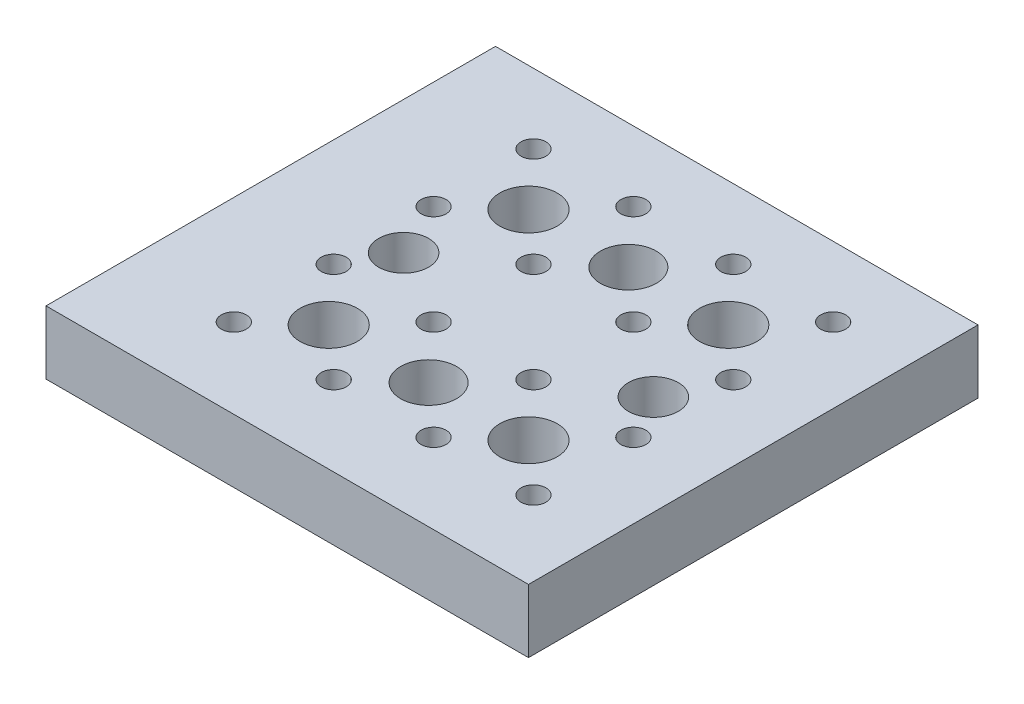
ISO-10303-21;
HEADER;
FILE_DESCRIPTION(('STEP AP214'),'2;1');
FILE_NAME('part.step','',(''),(''),'','','');
FILE_SCHEMA(('AUTOMOTIVE_DESIGN { 1 0 10303 214 1 1 1 1 }'));
ENDSEC;
DATA;
#1=APPLICATION_CONTEXT('core data for automotive mechanical design processes');
#2=APPLICATION_PROTOCOL_DEFINITION('international standard','automotive_design',2000,#1);
#3=PRODUCT_CONTEXT('',#1,'mechanical');
#4=PRODUCT('Part','Part','',(#3));
#5=PRODUCT_RELATED_PRODUCT_CATEGORY('part','',(#4));
#6=PRODUCT_DEFINITION_FORMATION('','',#4);
#7=PRODUCT_DEFINITION_CONTEXT('part definition',#1,'design');
#8=PRODUCT_DEFINITION('design','',#6,#7);
#9=PRODUCT_DEFINITION_SHAPE('','',#8);
#10=(LENGTH_UNIT() NAMED_UNIT(*) SI_UNIT(.MILLI.,.METRE.));
#11=(NAMED_UNIT(*) PLANE_ANGLE_UNIT() SI_UNIT($,.RADIAN.));
#12=(NAMED_UNIT(*) SI_UNIT($,.STERADIAN.) SOLID_ANGLE_UNIT());
#13=UNCERTAINTY_MEASURE_WITH_UNIT(LENGTH_MEASURE(1.E-05),#10,'distance_accuracy_value','');
#14=(GEOMETRIC_REPRESENTATION_CONTEXT(3) GLOBAL_UNCERTAINTY_ASSIGNED_CONTEXT((#13)) GLOBAL_UNIT_ASSIGNED_CONTEXT((#10,
#11,#12)) REPRESENTATION_CONTEXT('',''));
#15=CARTESIAN_POINT('',(0.,0.,0.));
#16=DIRECTION('',(0.,0.,1.));
#17=DIRECTION('',(1.,0.,0.));
#18=AXIS2_PLACEMENT_3D('',#15,#16,#17);
#19=CARTESIAN_POINT('',(0.,6.35,0.));
#20=DIRECTION('',(0.,1.,0.));
#21=DIRECTION('',(0.,0.,1.));
#22=AXIS2_PLACEMENT_3D('',#19,#20,#21);
#23=PLANE('',#22);
#24=CARTESIAN_POINT('',(38.3,6.35,22.5));
#25=DIRECTION('',(0.,1.,0.));
#26=DIRECTION('',(0.,0.,1.));
#27=AXIS2_PLACEMENT_3D('',#24,#25,#26);
#28=CIRCLE('',#27,2.49999999999999);
#29=CARTESIAN_POINT('',(38.3,6.35,25.));
#30=VERTEX_POINT('',#29);
#31=EDGE_CURVE('E306',#30,#30,#28,.T.);
#32=ORIENTED_EDGE('',*,*,#31,.F.);
#33=EDGE_LOOP('',(#32));
#34=FACE_BOUND('',#33,.T.);
#35=CARTESIAN_POINT('',(25.8,6.35,12.5));
#36=DIRECTION('',(0.,1.,0.));
#37=DIRECTION('',(0.,0.,1.));
#38=AXIS2_PLACEMENT_3D('',#35,#36,#37);
#39=CIRCLE('',#38,2.8);
#40=CARTESIAN_POINT('',(25.8,6.35,15.3));
#41=VERTEX_POINT('',#40);
#42=EDGE_CURVE('E290',#41,#41,#39,.T.);
#43=ORIENTED_EDGE('',*,*,#42,.F.);
#44=EDGE_LOOP('',(#43));
#45=FACE_BOUND('',#44,.T.);
#46=CARTESIAN_POINT('',(10.8000000000002,6.35,27.));
#47=DIRECTION('',(0.,1.,0.));
#48=DIRECTION('',(0.,0.,1.));
#49=AXIS2_PLACEMENT_3D('',#46,#47,#48);
#50=CIRCLE('',#49,1.25);
#51=CARTESIAN_POINT('',(10.8000000000002,6.35,28.25));
#52=VERTEX_POINT('',#51);
#53=EDGE_CURVE('E274',#52,#52,#50,.T.);
#54=ORIENTED_EDGE('',*,*,#53,.F.);
#55=EDGE_LOOP('',(#54));
#56=FACE_BOUND('',#55,.T.);
#57=CARTESIAN_POINT('',(40.8000000000003,6.35,37.));
#58=DIRECTION('',(0.,1.,0.));
#59=DIRECTION('',(0.,0.,1.));
#60=AXIS2_PLACEMENT_3D('',#57,#58,#59);
#61=CIRCLE('',#60,1.25);
#62=CARTESIAN_POINT('',(40.8000000000003,6.35,38.25));
#63=VERTEX_POINT('',#62);
#64=EDGE_CURVE('E258',#63,#63,#61,.T.);
#65=ORIENTED_EDGE('',*,*,#64,.F.);
#66=EDGE_LOOP('',(#65));
#67=FACE_BOUND('',#66,.T.);
#68=CARTESIAN_POINT('',(20.8000000000003,6.35,37.));
#69=DIRECTION('',(0.,1.,0.));
#70=DIRECTION('',(0.,0.,1.));
#71=AXIS2_PLACEMENT_3D('',#68,#69,#70);
#72=CIRCLE('',#71,1.25);
#73=CARTESIAN_POINT('',(20.8000000000003,6.35,38.25));
#74=VERTEX_POINT('',#73);
#75=EDGE_CURVE('E242',#74,#74,#72,.T.);
#76=ORIENTED_EDGE('',*,*,#75,.F.);
#77=EDGE_LOOP('',(#76));
#78=FACE_BOUND('',#77,.T.);
#79=CARTESIAN_POINT('',(30.8000000000002,6.35,27.));
#80=DIRECTION('',(0.,1.,0.));
#81=DIRECTION('',(0.,0.,1.));
#82=AXIS2_PLACEMENT_3D('',#79,#80,#81);
#83=CIRCLE('',#82,1.25);
#84=CARTESIAN_POINT('',(30.8000000000002,6.35,28.25));
#85=VERTEX_POINT('',#84);
#86=EDGE_CURVE('E226',#85,#85,#83,.T.);
#87=ORIENTED_EDGE('',*,*,#86,.F.);
#88=EDGE_LOOP('',(#87));
#89=FACE_BOUND('',#88,.T.);
#90=CARTESIAN_POINT('',(40.8000000000001,6.35,17.));
#91=DIRECTION('',(0.,1.,0.));
#92=DIRECTION('',(0.,0.,1.));
#93=AXIS2_PLACEMENT_3D('',#90,#91,#92);
#94=CIRCLE('',#93,1.25);
#95=CARTESIAN_POINT('',(40.8000000000001,6.35,18.25));
#96=VERTEX_POINT('',#95);
#97=EDGE_CURVE('E210',#96,#96,#94,.T.);
#98=ORIENTED_EDGE('',*,*,#97,.F.);
#99=EDGE_LOOP('',(#98));
#100=FACE_BOUND('',#99,.T.);
#101=CARTESIAN_POINT('',(20.8000000000001,6.35,17.));
#102=DIRECTION('',(0.,1.,0.));
#103=DIRECTION('',(0.,0.,1.));
#104=AXIS2_PLACEMENT_3D('',#101,#102,#103);
#105=CIRCLE('',#104,1.25);
#106=CARTESIAN_POINT('',(20.8000000000001,6.35,18.25));
#107=VERTEX_POINT('',#106);
#108=EDGE_CURVE('E194',#107,#107,#105,.T.);
#109=ORIENTED_EDGE('',*,*,#108,.F.);
#110=EDGE_LOOP('',(#109));
#111=FACE_BOUND('',#110,.T.);
#112=CARTESIAN_POINT('',(10.8,6.35,7.));
#113=DIRECTION('',(0.,1.,0.));
#114=DIRECTION('',(0.,0.,1.));
#115=AXIS2_PLACEMENT_3D('',#112,#113,#114);
#116=CIRCLE('',#115,1.25);
#117=CARTESIAN_POINT('',(10.8,6.35,8.25));
#118=VERTEX_POINT('',#117);
#119=EDGE_CURVE('E178',#118,#118,#116,.T.);
#120=ORIENTED_EDGE('',*,*,#119,.F.);
#121=EDGE_LOOP('',(#120));
#122=FACE_BOUND('',#121,.T.);
#123=CARTESIAN_POINT('',(20.8,6.35,7.));
#124=DIRECTION('',(0.,1.,0.));
#125=DIRECTION('',(0.,0.,1.));
#126=AXIS2_PLACEMENT_3D('',#123,#124,#125);
#127=CIRCLE('',#126,1.25);
#128=CARTESIAN_POINT('',(20.8,6.35,8.25));
#129=VERTEX_POINT('',#128);
#130=EDGE_CURVE('E162',#129,#129,#127,.T.);
#131=ORIENTED_EDGE('',*,*,#130,.F.);
#132=EDGE_LOOP('',(#131));
#133=FACE_BOUND('',#132,.T.);
#134=CARTESIAN_POINT('',(15.8,6.35,32.5));
#135=DIRECTION('',(0.,1.,0.));
#136=DIRECTION('',(0.,0.,1.));
#137=AXIS2_PLACEMENT_3D('',#134,#135,#136);
#138=CIRCLE('',#137,2.875);
#139=CARTESIAN_POINT('',(15.8,6.35,35.375));
#140=VERTEX_POINT('',#139);
#141=EDGE_CURVE('E146',#140,#140,#138,.T.);
#142=ORIENTED_EDGE('',*,*,#141,.F.);
#143=EDGE_LOOP('',(#142));
#144=FACE_BOUND('',#143,.T.);
#145=CARTESIAN_POINT('',(15.8,6.35,12.5));
#146=DIRECTION('',(0.,1.,0.));
#147=DIRECTION('',(0.,0.,1.));
#148=AXIS2_PLACEMENT_3D('',#145,#146,#147);
#149=CIRCLE('',#148,2.875);
#150=CARTESIAN_POINT('',(15.8,6.35,15.375));
#151=VERTEX_POINT('',#150);
#152=EDGE_CURVE('E116',#151,#151,#149,.T.);
#153=ORIENTED_EDGE('',*,*,#152,.F.);
#154=EDGE_LOOP('',(#153));
#155=FACE_BOUND('',#154,.T.);
#156=DIRECTION('',(0.,0.,1.));
#157=VECTOR('',#156,1.);
#158=CARTESIAN_POINT('',(0.,6.35,0.));
#159=LINE('',#158,#157);
#160=CARTESIAN_POINT('',(0.,6.35,0.));
#161=VERTEX_POINT('',#160);
#162=CARTESIAN_POINT('',(0.,6.35,45.));
#163=VERTEX_POINT('',#162);
#164=EDGE_CURVE('E96',#161,#163,#159,.T.);
#165=ORIENTED_EDGE('',*,*,#164,.T.);
#166=DIRECTION('',(1.,0.,0.));
#167=VECTOR('',#166,1.);
#168=CARTESIAN_POINT('',(0.,6.35,45.));
#169=LINE('',#168,#167);
#170=CARTESIAN_POINT('',(48.3,6.35,45.));
#171=VERTEX_POINT('',#170);
#172=EDGE_CURVE('E91',#163,#171,#169,.T.);
#173=ORIENTED_EDGE('',*,*,#172,.T.);
#174=DIRECTION('',(0.,0.,-1.));
#175=VECTOR('',#174,1.);
#176=CARTESIAN_POINT('',(48.3,6.35,0.));
#177=LINE('',#176,#175);
#178=CARTESIAN_POINT('',(48.3,6.35,0.));
#179=VERTEX_POINT('',#178);
#180=EDGE_CURVE('E94',#171,#179,#177,.T.);
#181=ORIENTED_EDGE('',*,*,#180,.T.);
#182=DIRECTION('',(-1.,0.,0.));
#183=VECTOR('',#182,1.);
#184=CARTESIAN_POINT('',(0.,6.35,0.));
#185=LINE('',#184,#183);
#186=EDGE_CURVE('E61',#179,#161,#185,.T.);
#187=ORIENTED_EDGE('',*,*,#186,.T.);
#188=EDGE_LOOP('',(#165,#173,#181,#187));
#189=FACE_BOUND('',#188,.T.);
#190=CARTESIAN_POINT('',(35.8,6.35,12.5));
#191=DIRECTION('',(0.,1.,0.));
#192=DIRECTION('',(0.,0.,1.));
#193=AXIS2_PLACEMENT_3D('',#190,#191,#192);
#194=CIRCLE('',#193,2.875);
#195=CARTESIAN_POINT('',(35.8,6.35,15.375));
#196=VERTEX_POINT('',#195);
#197=EDGE_CURVE('E138',#196,#196,#194,.T.);
#198=ORIENTED_EDGE('',*,*,#197,.F.);
#199=EDGE_LOOP('',(#198));
#200=FACE_BOUND('',#199,.T.);
#201=CARTESIAN_POINT('',(35.8,6.35,32.5));
#202=DIRECTION('',(0.,1.,0.));
#203=DIRECTION('',(0.,0.,1.));
#204=AXIS2_PLACEMENT_3D('',#201,#202,#203);
#205=CIRCLE('',#204,2.875);
#206=CARTESIAN_POINT('',(35.8,6.35,35.375));
#207=VERTEX_POINT('',#206);
#208=EDGE_CURVE('E154',#207,#207,#205,.T.);
#209=ORIENTED_EDGE('',*,*,#208,.F.);
#210=EDGE_LOOP('',(#209));
#211=FACE_BOUND('',#210,.T.);
#212=CARTESIAN_POINT('',(30.8,6.35,7.));
#213=DIRECTION('',(0.,1.,0.));
#214=DIRECTION('',(0.,0.,1.));
#215=AXIS2_PLACEMENT_3D('',#212,#213,#214);
#216=CIRCLE('',#215,1.25);
#217=CARTESIAN_POINT('',(30.8,6.35,8.25));
#218=VERTEX_POINT('',#217);
#219=EDGE_CURVE('E170',#218,#218,#216,.T.);
#220=ORIENTED_EDGE('',*,*,#219,.F.);
#221=EDGE_LOOP('',(#220));
#222=FACE_BOUND('',#221,.T.);
#223=CARTESIAN_POINT('',(40.8,6.35,7.));
#224=DIRECTION('',(0.,1.,0.));
#225=DIRECTION('',(0.,0.,1.));
#226=AXIS2_PLACEMENT_3D('',#223,#224,#225);
#227=CIRCLE('',#226,1.25);
#228=CARTESIAN_POINT('',(40.8,6.35,8.25));
#229=VERTEX_POINT('',#228);
#230=EDGE_CURVE('E186',#229,#229,#227,.T.);
#231=ORIENTED_EDGE('',*,*,#230,.F.);
#232=EDGE_LOOP('',(#231));
#233=FACE_BOUND('',#232,.T.);
#234=CARTESIAN_POINT('',(30.8000000000001,6.35,17.));
#235=DIRECTION('',(0.,1.,0.));
#236=DIRECTION('',(0.,0.,1.));
#237=AXIS2_PLACEMENT_3D('',#234,#235,#236);
#238=CIRCLE('',#237,1.25);
#239=CARTESIAN_POINT('',(30.8000000000001,6.35,18.25));
#240=VERTEX_POINT('',#239);
#241=EDGE_CURVE('E202',#240,#240,#238,.T.);
#242=ORIENTED_EDGE('',*,*,#241,.F.);
#243=EDGE_LOOP('',(#242));
#244=FACE_BOUND('',#243,.T.);
#245=CARTESIAN_POINT('',(20.8000000000002,6.35,27.));
#246=DIRECTION('',(0.,1.,0.));
#247=DIRECTION('',(0.,0.,1.));
#248=AXIS2_PLACEMENT_3D('',#245,#246,#247);
#249=CIRCLE('',#248,1.25);
#250=CARTESIAN_POINT('',(20.8000000000002,6.35,28.25));
#251=VERTEX_POINT('',#250);
#252=EDGE_CURVE('E218',#251,#251,#249,.T.);
#253=ORIENTED_EDGE('',*,*,#252,.F.);
#254=EDGE_LOOP('',(#253));
#255=FACE_BOUND('',#254,.T.);
#256=CARTESIAN_POINT('',(40.8000000000002,6.35,27.));
#257=DIRECTION('',(0.,1.,0.));
#258=DIRECTION('',(0.,0.,1.));
#259=AXIS2_PLACEMENT_3D('',#256,#257,#258);
#260=CIRCLE('',#259,1.25);
#261=CARTESIAN_POINT('',(40.8000000000002,6.35,28.25));
#262=VERTEX_POINT('',#261);
#263=EDGE_CURVE('E234',#262,#262,#260,.T.);
#264=ORIENTED_EDGE('',*,*,#263,.F.);
#265=EDGE_LOOP('',(#264));
#266=FACE_BOUND('',#265,.T.);
#267=CARTESIAN_POINT('',(30.8000000000003,6.35,37.));
#268=DIRECTION('',(0.,1.,0.));
#269=DIRECTION('',(0.,0.,1.));
#270=AXIS2_PLACEMENT_3D('',#267,#268,#269);
#271=CIRCLE('',#270,1.25);
#272=CARTESIAN_POINT('',(30.8000000000003,6.35,38.25));
#273=VERTEX_POINT('',#272);
#274=EDGE_CURVE('E250',#273,#273,#271,.T.);
#275=ORIENTED_EDGE('',*,*,#274,.F.);
#276=EDGE_LOOP('',(#275));
#277=FACE_BOUND('',#276,.T.);
#278=CARTESIAN_POINT('',(10.8000000000001,6.35,17.));
#279=DIRECTION('',(0.,1.,0.));
#280=DIRECTION('',(0.,0.,1.));
#281=AXIS2_PLACEMENT_3D('',#278,#279,#280);
#282=CIRCLE('',#281,1.25);
#283=CARTESIAN_POINT('',(10.8000000000001,6.35,18.25));
#284=VERTEX_POINT('',#283);
#285=EDGE_CURVE('E266',#284,#284,#282,.T.);
#286=ORIENTED_EDGE('',*,*,#285,.F.);
#287=EDGE_LOOP('',(#286));
#288=FACE_BOUND('',#287,.T.);
#289=CARTESIAN_POINT('',(10.8000000000003,6.35,37.));
#290=DIRECTION('',(0.,1.,0.));
#291=DIRECTION('',(0.,0.,1.));
#292=AXIS2_PLACEMENT_3D('',#289,#290,#291);
#293=CIRCLE('',#292,1.25);
#294=CARTESIAN_POINT('',(10.8000000000003,6.35,38.25));
#295=VERTEX_POINT('',#294);
#296=EDGE_CURVE('E282',#295,#295,#293,.T.);
#297=ORIENTED_EDGE('',*,*,#296,.F.);
#298=EDGE_LOOP('',(#297));
#299=FACE_BOUND('',#298,.T.);
#300=CARTESIAN_POINT('',(25.8,6.35,32.5));
#301=DIRECTION('',(0.,1.,0.));
#302=DIRECTION('',(0.,0.,1.));
#303=AXIS2_PLACEMENT_3D('',#300,#301,#302);
#304=CIRCLE('',#303,2.8);
#305=CARTESIAN_POINT('',(25.8,6.35,35.3));
#306=VERTEX_POINT('',#305);
#307=EDGE_CURVE('E298',#306,#306,#304,.T.);
#308=ORIENTED_EDGE('',*,*,#307,.F.);
#309=EDGE_LOOP('',(#308));
#310=FACE_BOUND('',#309,.T.);
#311=CARTESIAN_POINT('',(13.3,6.35,22.5));
#312=DIRECTION('',(0.,1.,0.));
#313=DIRECTION('',(0.,0.,1.));
#314=AXIS2_PLACEMENT_3D('',#311,#312,#313);
#315=CIRCLE('',#314,2.5);
#316=CARTESIAN_POINT('',(13.3,6.35,25.));
#317=VERTEX_POINT('',#316);
#318=EDGE_CURVE('E314',#317,#317,#315,.T.);
#319=ORIENTED_EDGE('',*,*,#318,.F.);
#320=EDGE_LOOP('',(#319));
#321=FACE_BOUND('',#320,.T.);
#322=ADVANCED_FACE('F43',(#34,#45,#56,#67,#78,#89,#100,#111,#122,#133,#144,#155,#189,#200,#211,
#222,#233,#244,#255,#266,#277,#288,#299,#310,#321),#23,.T.);
#323=CARTESIAN_POINT('',(0.,0.,0.));
#324=DIRECTION('',(0.,1.,0.));
#325=DIRECTION('',(0.,0.,1.));
#326=AXIS2_PLACEMENT_3D('',#323,#324,#325);
#327=PLANE('',#326);
#328=DIRECTION('',(0.,0.,1.));
#329=VECTOR('',#328,1.);
#330=CARTESIAN_POINT('',(0.,0.,0.));
#331=LINE('',#330,#329);
#332=CARTESIAN_POINT('',(0.,0.,0.));
#333=VERTEX_POINT('',#332);
#334=CARTESIAN_POINT('',(0.,0.,45.));
#335=VERTEX_POINT('',#334);
#336=EDGE_CURVE('E112',#333,#335,#331,.T.);
#337=ORIENTED_EDGE('',*,*,#336,.F.);
#338=DIRECTION('',(-1.,0.,0.));
#339=VECTOR('',#338,1.);
#340=CARTESIAN_POINT('',(0.,0.,0.));
#341=LINE('',#340,#339);
#342=CARTESIAN_POINT('',(48.3,0.,0.));
#343=VERTEX_POINT('',#342);
#344=EDGE_CURVE('E84',#343,#333,#341,.T.);
#345=ORIENTED_EDGE('',*,*,#344,.F.);
#346=DIRECTION('',(0.,0.,-1.));
#347=VECTOR('',#346,1.);
#348=CARTESIAN_POINT('',(48.3,0.,0.));
#349=LINE('',#348,#347);
#350=CARTESIAN_POINT('',(48.3,0.,45.));
#351=VERTEX_POINT('',#350);
#352=EDGE_CURVE('E78',#351,#343,#349,.T.);
#353=ORIENTED_EDGE('',*,*,#352,.F.);
#354=DIRECTION('',(1.,0.,0.));
#355=VECTOR('',#354,1.);
#356=CARTESIAN_POINT('',(0.,0.,45.));
#357=LINE('',#356,#355);
#358=EDGE_CURVE('E101',#335,#351,#357,.T.);
#359=ORIENTED_EDGE('',*,*,#358,.F.);
#360=EDGE_LOOP('',(#337,#345,#353,#359));
#361=FACE_BOUND('',#360,.T.);
#362=CARTESIAN_POINT('',(15.8,0.,12.5));
#363=DIRECTION('',(0.,1.,0.));
#364=DIRECTION('',(0.,0.,1.));
#365=AXIS2_PLACEMENT_3D('',#362,#363,#364);
#366=CIRCLE('',#365,2.875);
#367=CARTESIAN_POINT('',(15.8,0.,15.375));
#368=VERTEX_POINT('',#367);
#369=EDGE_CURVE('E134',#368,#368,#366,.T.);
#370=ORIENTED_EDGE('',*,*,#369,.T.);
#371=EDGE_LOOP('',(#370));
#372=FACE_BOUND('',#371,.T.);
#373=CARTESIAN_POINT('',(35.8,0.,12.5));
#374=DIRECTION('',(0.,1.,0.));
#375=DIRECTION('',(0.,0.,1.));
#376=AXIS2_PLACEMENT_3D('',#373,#374,#375);
#377=CIRCLE('',#376,2.875);
#378=CARTESIAN_POINT('',(35.8,0.,15.375));
#379=VERTEX_POINT('',#378);
#380=EDGE_CURVE('E142',#379,#379,#377,.T.);
#381=ORIENTED_EDGE('',*,*,#380,.T.);
#382=EDGE_LOOP('',(#381));
#383=FACE_BOUND('',#382,.T.);
#384=CARTESIAN_POINT('',(15.8,0.,32.5));
#385=DIRECTION('',(0.,1.,0.));
#386=DIRECTION('',(0.,0.,1.));
#387=AXIS2_PLACEMENT_3D('',#384,#385,#386);
#388=CIRCLE('',#387,2.875);
#389=CARTESIAN_POINT('',(15.8,0.,35.375));
#390=VERTEX_POINT('',#389);
#391=EDGE_CURVE('E150',#390,#390,#388,.T.);
#392=ORIENTED_EDGE('',*,*,#391,.T.);
#393=EDGE_LOOP('',(#392));
#394=FACE_BOUND('',#393,.T.);
#395=CARTESIAN_POINT('',(35.8,0.,32.5));
#396=DIRECTION('',(0.,1.,0.));
#397=DIRECTION('',(0.,0.,1.));
#398=AXIS2_PLACEMENT_3D('',#395,#396,#397);
#399=CIRCLE('',#398,2.875);
#400=CARTESIAN_POINT('',(35.8,0.,35.375));
#401=VERTEX_POINT('',#400);
#402=EDGE_CURVE('E158',#401,#401,#399,.T.);
#403=ORIENTED_EDGE('',*,*,#402,.T.);
#404=EDGE_LOOP('',(#403));
#405=FACE_BOUND('',#404,.T.);
#406=CARTESIAN_POINT('',(20.8,0.,7.));
#407=DIRECTION('',(0.,1.,0.));
#408=DIRECTION('',(0.,0.,1.));
#409=AXIS2_PLACEMENT_3D('',#406,#407,#408);
#410=CIRCLE('',#409,1.25);
#411=CARTESIAN_POINT('',(20.8,0.,8.25));
#412=VERTEX_POINT('',#411);
#413=EDGE_CURVE('E166',#412,#412,#410,.T.);
#414=ORIENTED_EDGE('',*,*,#413,.T.);
#415=EDGE_LOOP('',(#414));
#416=FACE_BOUND('',#415,.T.);
#417=CARTESIAN_POINT('',(30.8,0.,7.));
#418=DIRECTION('',(0.,1.,0.));
#419=DIRECTION('',(0.,0.,1.));
#420=AXIS2_PLACEMENT_3D('',#417,#418,#419);
#421=CIRCLE('',#420,1.25);
#422=CARTESIAN_POINT('',(30.8,0.,8.25));
#423=VERTEX_POINT('',#422);
#424=EDGE_CURVE('E174',#423,#423,#421,.T.);
#425=ORIENTED_EDGE('',*,*,#424,.T.);
#426=EDGE_LOOP('',(#425));
#427=FACE_BOUND('',#426,.T.);
#428=CARTESIAN_POINT('',(10.8,0.,7.));
#429=DIRECTION('',(0.,1.,0.));
#430=DIRECTION('',(0.,0.,1.));
#431=AXIS2_PLACEMENT_3D('',#428,#429,#430);
#432=CIRCLE('',#431,1.25);
#433=CARTESIAN_POINT('',(10.8,0.,8.25));
#434=VERTEX_POINT('',#433);
#435=EDGE_CURVE('E182',#434,#434,#432,.T.);
#436=ORIENTED_EDGE('',*,*,#435,.T.);
#437=EDGE_LOOP('',(#436));
#438=FACE_BOUND('',#437,.T.);
#439=CARTESIAN_POINT('',(40.8,0.,7.));
#440=DIRECTION('',(0.,1.,0.));
#441=DIRECTION('',(0.,0.,1.));
#442=AXIS2_PLACEMENT_3D('',#439,#440,#441);
#443=CIRCLE('',#442,1.25);
#444=CARTESIAN_POINT('',(40.8,0.,8.25));
#445=VERTEX_POINT('',#444);
#446=EDGE_CURVE('E190',#445,#445,#443,.T.);
#447=ORIENTED_EDGE('',*,*,#446,.T.);
#448=EDGE_LOOP('',(#447));
#449=FACE_BOUND('',#448,.T.);
#450=CARTESIAN_POINT('',(20.8000000000001,0.,17.));
#451=DIRECTION('',(0.,1.,0.));
#452=DIRECTION('',(0.,0.,1.));
#453=AXIS2_PLACEMENT_3D('',#450,#451,#452);
#454=CIRCLE('',#453,1.25);
#455=CARTESIAN_POINT('',(20.8000000000001,0.,18.25));
#456=VERTEX_POINT('',#455);
#457=EDGE_CURVE('E198',#456,#456,#454,.T.);
#458=ORIENTED_EDGE('',*,*,#457,.T.);
#459=EDGE_LOOP('',(#458));
#460=FACE_BOUND('',#459,.T.);
#461=CARTESIAN_POINT('',(30.8000000000001,0.,17.));
#462=DIRECTION('',(0.,1.,0.));
#463=DIRECTION('',(0.,0.,1.));
#464=AXIS2_PLACEMENT_3D('',#461,#462,#463);
#465=CIRCLE('',#464,1.25);
#466=CARTESIAN_POINT('',(30.8000000000001,0.,18.25));
#467=VERTEX_POINT('',#466);
#468=EDGE_CURVE('E206',#467,#467,#465,.T.);
#469=ORIENTED_EDGE('',*,*,#468,.T.);
#470=EDGE_LOOP('',(#469));
#471=FACE_BOUND('',#470,.T.);
#472=CARTESIAN_POINT('',(40.8000000000001,0.,17.));
#473=DIRECTION('',(0.,1.,0.));
#474=DIRECTION('',(0.,0.,1.));
#475=AXIS2_PLACEMENT_3D('',#472,#473,#474);
#476=CIRCLE('',#475,1.25);
#477=CARTESIAN_POINT('',(40.8000000000001,0.,18.25));
#478=VERTEX_POINT('',#477);
#479=EDGE_CURVE('E214',#478,#478,#476,.T.);
#480=ORIENTED_EDGE('',*,*,#479,.T.);
#481=EDGE_LOOP('',(#480));
#482=FACE_BOUND('',#481,.T.);
#483=CARTESIAN_POINT('',(20.8000000000002,0.,27.));
#484=DIRECTION('',(0.,1.,0.));
#485=DIRECTION('',(0.,0.,1.));
#486=AXIS2_PLACEMENT_3D('',#483,#484,#485);
#487=CIRCLE('',#486,1.25);
#488=CARTESIAN_POINT('',(20.8000000000002,0.,28.25));
#489=VERTEX_POINT('',#488);
#490=EDGE_CURVE('E222',#489,#489,#487,.T.);
#491=ORIENTED_EDGE('',*,*,#490,.T.);
#492=EDGE_LOOP('',(#491));
#493=FACE_BOUND('',#492,.T.);
#494=CARTESIAN_POINT('',(30.8000000000002,0.,27.));
#495=DIRECTION('',(0.,1.,0.));
#496=DIRECTION('',(0.,0.,1.));
#497=AXIS2_PLACEMENT_3D('',#494,#495,#496);
#498=CIRCLE('',#497,1.25);
#499=CARTESIAN_POINT('',(30.8000000000002,0.,28.25));
#500=VERTEX_POINT('',#499);
#501=EDGE_CURVE('E230',#500,#500,#498,.T.);
#502=ORIENTED_EDGE('',*,*,#501,.T.);
#503=EDGE_LOOP('',(#502));
#504=FACE_BOUND('',#503,.T.);
#505=CARTESIAN_POINT('',(40.8000000000002,0.,27.));
#506=DIRECTION('',(0.,1.,0.));
#507=DIRECTION('',(0.,0.,1.));
#508=AXIS2_PLACEMENT_3D('',#505,#506,#507);
#509=CIRCLE('',#508,1.25);
#510=CARTESIAN_POINT('',(40.8000000000002,0.,28.25));
#511=VERTEX_POINT('',#510);
#512=EDGE_CURVE('E238',#511,#511,#509,.T.);
#513=ORIENTED_EDGE('',*,*,#512,.T.);
#514=EDGE_LOOP('',(#513));
#515=FACE_BOUND('',#514,.T.);
#516=CARTESIAN_POINT('',(20.8000000000003,0.,37.));
#517=DIRECTION('',(0.,1.,0.));
#518=DIRECTION('',(0.,0.,1.));
#519=AXIS2_PLACEMENT_3D('',#516,#517,#518);
#520=CIRCLE('',#519,1.25);
#521=CARTESIAN_POINT('',(20.8000000000003,0.,38.25));
#522=VERTEX_POINT('',#521);
#523=EDGE_CURVE('E246',#522,#522,#520,.T.);
#524=ORIENTED_EDGE('',*,*,#523,.T.);
#525=EDGE_LOOP('',(#524));
#526=FACE_BOUND('',#525,.T.);
#527=CARTESIAN_POINT('',(30.8000000000003,0.,37.));
#528=DIRECTION('',(0.,1.,0.));
#529=DIRECTION('',(0.,0.,1.));
#530=AXIS2_PLACEMENT_3D('',#527,#528,#529);
#531=CIRCLE('',#530,1.25);
#532=CARTESIAN_POINT('',(30.8000000000003,0.,38.25));
#533=VERTEX_POINT('',#532);
#534=EDGE_CURVE('E254',#533,#533,#531,.T.);
#535=ORIENTED_EDGE('',*,*,#534,.T.);
#536=EDGE_LOOP('',(#535));
#537=FACE_BOUND('',#536,.T.);
#538=CARTESIAN_POINT('',(40.8000000000003,0.,37.));
#539=DIRECTION('',(0.,1.,0.));
#540=DIRECTION('',(0.,0.,1.));
#541=AXIS2_PLACEMENT_3D('',#538,#539,#540);
#542=CIRCLE('',#541,1.25);
#543=CARTESIAN_POINT('',(40.8000000000003,0.,38.25));
#544=VERTEX_POINT('',#543);
#545=EDGE_CURVE('E262',#544,#544,#542,.T.);
#546=ORIENTED_EDGE('',*,*,#545,.T.);
#547=EDGE_LOOP('',(#546));
#548=FACE_BOUND('',#547,.T.);
#549=CARTESIAN_POINT('',(10.8000000000001,0.,17.));
#550=DIRECTION('',(0.,1.,0.));
#551=DIRECTION('',(0.,0.,1.));
#552=AXIS2_PLACEMENT_3D('',#549,#550,#551);
#553=CIRCLE('',#552,1.25);
#554=CARTESIAN_POINT('',(10.8000000000001,0.,18.25));
#555=VERTEX_POINT('',#554);
#556=EDGE_CURVE('E270',#555,#555,#553,.T.);
#557=ORIENTED_EDGE('',*,*,#556,.T.);
#558=EDGE_LOOP('',(#557));
#559=FACE_BOUND('',#558,.T.);
#560=CARTESIAN_POINT('',(10.8000000000002,0.,27.));
#561=DIRECTION('',(0.,1.,0.));
#562=DIRECTION('',(0.,0.,1.));
#563=AXIS2_PLACEMENT_3D('',#560,#561,#562);
#564=CIRCLE('',#563,1.25);
#565=CARTESIAN_POINT('',(10.8000000000002,0.,28.25));
#566=VERTEX_POINT('',#565);
#567=EDGE_CURVE('E278',#566,#566,#564,.T.);
#568=ORIENTED_EDGE('',*,*,#567,.T.);
#569=EDGE_LOOP('',(#568));
#570=FACE_BOUND('',#569,.T.);
#571=CARTESIAN_POINT('',(10.8000000000003,0.,37.));
#572=DIRECTION('',(0.,1.,0.));
#573=DIRECTION('',(0.,0.,1.));
#574=AXIS2_PLACEMENT_3D('',#571,#572,#573);
#575=CIRCLE('',#574,1.25);
#576=CARTESIAN_POINT('',(10.8000000000003,0.,38.25));
#577=VERTEX_POINT('',#576);
#578=EDGE_CURVE('E286',#577,#577,#575,.T.);
#579=ORIENTED_EDGE('',*,*,#578,.T.);
#580=EDGE_LOOP('',(#579));
#581=FACE_BOUND('',#580,.T.);
#582=CARTESIAN_POINT('',(25.8,0.,12.5));
#583=DIRECTION('',(0.,1.,0.));
#584=DIRECTION('',(0.,0.,1.));
#585=AXIS2_PLACEMENT_3D('',#582,#583,#584);
#586=CIRCLE('',#585,2.8);
#587=CARTESIAN_POINT('',(25.8,0.,15.3));
#588=VERTEX_POINT('',#587);
#589=EDGE_CURVE('E294',#588,#588,#586,.T.);
#590=ORIENTED_EDGE('',*,*,#589,.T.);
#591=EDGE_LOOP('',(#590));
#592=FACE_BOUND('',#591,.T.);
#593=CARTESIAN_POINT('',(25.8,0.,32.5));
#594=DIRECTION('',(0.,1.,0.));
#595=DIRECTION('',(0.,0.,1.));
#596=AXIS2_PLACEMENT_3D('',#593,#594,#595);
#597=CIRCLE('',#596,2.8);
#598=CARTESIAN_POINT('',(25.8,0.,35.3));
#599=VERTEX_POINT('',#598);
#600=EDGE_CURVE('E302',#599,#599,#597,.T.);
#601=ORIENTED_EDGE('',*,*,#600,.T.);
#602=EDGE_LOOP('',(#601));
#603=FACE_BOUND('',#602,.T.);
#604=CARTESIAN_POINT('',(38.3,0.,22.5));
#605=DIRECTION('',(0.,1.,0.));
#606=DIRECTION('',(0.,0.,1.));
#607=AXIS2_PLACEMENT_3D('',#604,#605,#606);
#608=CIRCLE('',#607,2.49999999999999);
#609=CARTESIAN_POINT('',(38.3,0.,25.));
#610=VERTEX_POINT('',#609);
#611=EDGE_CURVE('E310',#610,#610,#608,.T.);
#612=ORIENTED_EDGE('',*,*,#611,.T.);
#613=EDGE_LOOP('',(#612));
#614=FACE_BOUND('',#613,.T.);
#615=CARTESIAN_POINT('',(13.3,0.,22.5));
#616=DIRECTION('',(0.,1.,0.));
#617=DIRECTION('',(0.,0.,1.));
#618=AXIS2_PLACEMENT_3D('',#615,#616,#617);
#619=CIRCLE('',#618,2.5);
#620=CARTESIAN_POINT('',(13.3,0.,25.));
#621=VERTEX_POINT('',#620);
#622=EDGE_CURVE('E318',#621,#621,#619,.T.);
#623=ORIENTED_EDGE('',*,*,#622,.T.);
#624=EDGE_LOOP('',(#623));
#625=FACE_BOUND('',#624,.T.);
#626=ADVANCED_FACE('F129',(#361,#372,#383,#394,#405,#416,#427,#438,#449,#460,#471,#482,#493,
#504,#515,#526,#537,#548,#559,#570,#581,#592,#603,#614,#625),#327,.F.);
#627=CARTESIAN_POINT('',(0.,6.35,0.));
#628=DIRECTION('',(1.,0.,0.));
#629=DIRECTION('',(0.,0.,-1.));
#630=AXIS2_PLACEMENT_3D('',#627,#628,#629);
#631=PLANE('',#630);
#632=ORIENTED_EDGE('',*,*,#336,.T.);
#633=DIRECTION('',(0.,-1.,0.));
#634=VECTOR('',#633,1.);
#635=CARTESIAN_POINT('',(0.,6.35,45.));
#636=LINE('',#635,#634);
#637=EDGE_CURVE('E11',#163,#335,#636,.T.);
#638=ORIENTED_EDGE('',*,*,#637,.F.);
#639=ORIENTED_EDGE('',*,*,#164,.F.);
#640=DIRECTION('',(0.,-1.,0.));
#641=VECTOR('',#640,1.);
#642=CARTESIAN_POINT('',(0.,6.35,0.));
#643=LINE('',#642,#641);
#644=EDGE_CURVE('E108',#161,#333,#643,.T.);
#645=ORIENTED_EDGE('',*,*,#644,.T.);
#646=EDGE_LOOP('',(#632,#638,#639,#645));
#647=FACE_BOUND('',#646,.T.);
#648=ADVANCED_FACE('F45',(#647),#631,.F.);
#649=CARTESIAN_POINT('',(0.,6.35,45.));
#650=DIRECTION('',(0.,0.,-1.));
#651=DIRECTION('',(-1.,0.,0.));
#652=AXIS2_PLACEMENT_3D('',#649,#650,#651);
#653=PLANE('',#652);
#654=ORIENTED_EDGE('',*,*,#358,.T.);
#655=DIRECTION('',(0.,-1.,0.));
#656=VECTOR('',#655,1.);
#657=CARTESIAN_POINT('',(48.3,6.35,45.));
#658=LINE('',#657,#656);
#659=EDGE_CURVE('E53',#171,#351,#658,.T.);
#660=ORIENTED_EDGE('',*,*,#659,.F.);
#661=ORIENTED_EDGE('',*,*,#172,.F.);
#662=ORIENTED_EDGE('',*,*,#637,.T.);
#663=EDGE_LOOP('',(#654,#660,#661,#662));
#664=FACE_BOUND('',#663,.T.);
#665=ADVANCED_FACE('F100',(#664),#653,.F.);
#666=CARTESIAN_POINT('',(48.3,6.35,0.));
#667=DIRECTION('',(-1.,0.,0.));
#668=DIRECTION('',(0.,0.,1.));
#669=AXIS2_PLACEMENT_3D('',#666,#667,#668);
#670=PLANE('',#669);
#671=ORIENTED_EDGE('',*,*,#352,.T.);
#672=DIRECTION('',(0.,-1.,0.));
#673=VECTOR('',#672,1.);
#674=CARTESIAN_POINT('',(48.3,6.35,0.));
#675=LINE('',#674,#673);
#676=EDGE_CURVE('E103',#179,#343,#675,.T.);
#677=ORIENTED_EDGE('',*,*,#676,.F.);
#678=ORIENTED_EDGE('',*,*,#180,.F.);
#679=ORIENTED_EDGE('',*,*,#659,.T.);
#680=EDGE_LOOP('',(#671,#677,#678,#679));
#681=FACE_BOUND('',#680,.T.);
#682=ADVANCED_FACE('F104',(#681),#670,.F.);
#683=CARTESIAN_POINT('',(0.,6.35,0.));
#684=DIRECTION('',(0.,0.,1.));
#685=DIRECTION('',(1.,0.,0.));
#686=AXIS2_PLACEMENT_3D('',#683,#684,#685);
#687=PLANE('',#686);
#688=ORIENTED_EDGE('',*,*,#344,.T.);
#689=ORIENTED_EDGE('',*,*,#644,.F.);
#690=ORIENTED_EDGE('',*,*,#186,.F.);
#691=ORIENTED_EDGE('',*,*,#676,.T.);
#692=EDGE_LOOP('',(#688,#689,#690,#691));
#693=FACE_BOUND('',#692,.T.);
#694=ADVANCED_FACE('F126',(#693),#687,.F.);
#695=CARTESIAN_POINT('',(15.8,6.35,12.5));
#696=DIRECTION('',(0.,-1.,0.));
#697=DIRECTION('',(0.,0.,-1.));
#698=AXIS2_PLACEMENT_3D('',#695,#696,#697);
#699=CYLINDRICAL_SURFACE('',#698,2.875);
#700=ORIENTED_EDGE('',*,*,#152,.T.);
#701=EDGE_LOOP('',(#700));
#702=FACE_BOUND('',#701,.T.);
#703=ORIENTED_EDGE('',*,*,#369,.F.);
#704=EDGE_LOOP('',(#703));
#705=FACE_BOUND('',#704,.T.);
#706=ADVANCED_FACE('F339',(#702,#705),#699,.F.);
#707=CARTESIAN_POINT('',(35.8,6.35,12.5));
#708=DIRECTION('',(0.,-1.,0.));
#709=DIRECTION('',(0.,0.,-1.));
#710=AXIS2_PLACEMENT_3D('',#707,#708,#709);
#711=CYLINDRICAL_SURFACE('',#710,2.875);
#712=ORIENTED_EDGE('',*,*,#197,.T.);
#713=EDGE_LOOP('',(#712));
#714=FACE_BOUND('',#713,.T.);
#715=ORIENTED_EDGE('',*,*,#380,.F.);
#716=EDGE_LOOP('',(#715));
#717=FACE_BOUND('',#716,.T.);
#718=ADVANCED_FACE('F393',(#714,#717),#711,.F.);
#719=CARTESIAN_POINT('',(15.8,6.35,32.5));
#720=DIRECTION('',(0.,-1.,0.));
#721=DIRECTION('',(0.,0.,-1.));
#722=AXIS2_PLACEMENT_3D('',#719,#720,#721);
#723=CYLINDRICAL_SURFACE('',#722,2.875);
#724=ORIENTED_EDGE('',*,*,#141,.T.);
#725=EDGE_LOOP('',(#724));
#726=FACE_BOUND('',#725,.T.);
#727=ORIENTED_EDGE('',*,*,#391,.F.);
#728=EDGE_LOOP('',(#727));
#729=FACE_BOUND('',#728,.T.);
#730=ADVANCED_FACE('F402',(#726,#729),#723,.F.);
#731=CARTESIAN_POINT('',(35.8,6.35,32.5));
#732=DIRECTION('',(0.,-1.,0.));
#733=DIRECTION('',(0.,0.,-1.));
#734=AXIS2_PLACEMENT_3D('',#731,#732,#733);
#735=CYLINDRICAL_SURFACE('',#734,2.875);
#736=ORIENTED_EDGE('',*,*,#208,.T.);
#737=EDGE_LOOP('',(#736));
#738=FACE_BOUND('',#737,.T.);
#739=ORIENTED_EDGE('',*,*,#402,.F.);
#740=EDGE_LOOP('',(#739));
#741=FACE_BOUND('',#740,.T.);
#742=ADVANCED_FACE('F411',(#738,#741),#735,.F.);
#743=CARTESIAN_POINT('',(20.8,6.35,7.));
#744=DIRECTION('',(0.,-1.,0.));
#745=DIRECTION('',(0.,0.,-1.));
#746=AXIS2_PLACEMENT_3D('',#743,#744,#745);
#747=CYLINDRICAL_SURFACE('',#746,1.25);
#748=ORIENTED_EDGE('',*,*,#130,.T.);
#749=EDGE_LOOP('',(#748));
#750=FACE_BOUND('',#749,.T.);
#751=ORIENTED_EDGE('',*,*,#413,.F.);
#752=EDGE_LOOP('',(#751));
#753=FACE_BOUND('',#752,.T.);
#754=ADVANCED_FACE('F421',(#750,#753),#747,.F.);
#755=CARTESIAN_POINT('',(30.8,6.35,7.));
#756=DIRECTION('',(0.,-1.,0.));
#757=DIRECTION('',(0.,0.,-1.));
#758=AXIS2_PLACEMENT_3D('',#755,#756,#757);
#759=CYLINDRICAL_SURFACE('',#758,1.25);
#760=ORIENTED_EDGE('',*,*,#219,.T.);
#761=EDGE_LOOP('',(#760));
#762=FACE_BOUND('',#761,.T.);
#763=ORIENTED_EDGE('',*,*,#424,.F.);
#764=EDGE_LOOP('',(#763));
#765=FACE_BOUND('',#764,.T.);
#766=ADVANCED_FACE('F431',(#762,#765),#759,.F.);
#767=CARTESIAN_POINT('',(10.8,6.35,7.));
#768=DIRECTION('',(0.,-1.,0.));
#769=DIRECTION('',(0.,0.,-1.));
#770=AXIS2_PLACEMENT_3D('',#767,#768,#769);
#771=CYLINDRICAL_SURFACE('',#770,1.25);
#772=ORIENTED_EDGE('',*,*,#119,.T.);
#773=EDGE_LOOP('',(#772));
#774=FACE_BOUND('',#773,.T.);
#775=ORIENTED_EDGE('',*,*,#435,.F.);
#776=EDGE_LOOP('',(#775));
#777=FACE_BOUND('',#776,.T.);
#778=ADVANCED_FACE('F441',(#774,#777),#771,.F.);
#779=CARTESIAN_POINT('',(40.8,6.35,7.));
#780=DIRECTION('',(0.,-1.,0.));
#781=DIRECTION('',(0.,0.,-1.));
#782=AXIS2_PLACEMENT_3D('',#779,#780,#781);
#783=CYLINDRICAL_SURFACE('',#782,1.25);
#784=ORIENTED_EDGE('',*,*,#230,.T.);
#785=EDGE_LOOP('',(#784));
#786=FACE_BOUND('',#785,.T.);
#787=ORIENTED_EDGE('',*,*,#446,.F.);
#788=EDGE_LOOP('',(#787));
#789=FACE_BOUND('',#788,.T.);
#790=ADVANCED_FACE('F451',(#786,#789),#783,.F.);
#791=CARTESIAN_POINT('',(20.8000000000001,6.35,17.));
#792=DIRECTION('',(0.,-1.,0.));
#793=DIRECTION('',(0.,0.,-1.));
#794=AXIS2_PLACEMENT_3D('',#791,#792,#793);
#795=CYLINDRICAL_SURFACE('',#794,1.25);
#796=ORIENTED_EDGE('',*,*,#108,.T.);
#797=EDGE_LOOP('',(#796));
#798=FACE_BOUND('',#797,.T.);
#799=ORIENTED_EDGE('',*,*,#457,.F.);
#800=EDGE_LOOP('',(#799));
#801=FACE_BOUND('',#800,.T.);
#802=ADVANCED_FACE('F461',(#798,#801),#795,.F.);
#803=CARTESIAN_POINT('',(30.8000000000001,6.35,17.));
#804=DIRECTION('',(0.,-1.,0.));
#805=DIRECTION('',(0.,0.,-1.));
#806=AXIS2_PLACEMENT_3D('',#803,#804,#805);
#807=CYLINDRICAL_SURFACE('',#806,1.25);
#808=ORIENTED_EDGE('',*,*,#241,.T.);
#809=EDGE_LOOP('',(#808));
#810=FACE_BOUND('',#809,.T.);
#811=ORIENTED_EDGE('',*,*,#468,.F.);
#812=EDGE_LOOP('',(#811));
#813=FACE_BOUND('',#812,.T.);
#814=ADVANCED_FACE('F471',(#810,#813),#807,.F.);
#815=CARTESIAN_POINT('',(40.8000000000001,6.35,17.));
#816=DIRECTION('',(0.,-1.,0.));
#817=DIRECTION('',(0.,0.,-1.));
#818=AXIS2_PLACEMENT_3D('',#815,#816,#817);
#819=CYLINDRICAL_SURFACE('',#818,1.25);
#820=ORIENTED_EDGE('',*,*,#97,.T.);
#821=EDGE_LOOP('',(#820));
#822=FACE_BOUND('',#821,.T.);
#823=ORIENTED_EDGE('',*,*,#479,.F.);
#824=EDGE_LOOP('',(#823));
#825=FACE_BOUND('',#824,.T.);
#826=ADVANCED_FACE('F481',(#822,#825),#819,.F.);
#827=CARTESIAN_POINT('',(20.8000000000002,6.35,27.));
#828=DIRECTION('',(0.,-1.,0.));
#829=DIRECTION('',(0.,0.,-1.));
#830=AXIS2_PLACEMENT_3D('',#827,#828,#829);
#831=CYLINDRICAL_SURFACE('',#830,1.25);
#832=ORIENTED_EDGE('',*,*,#252,.T.);
#833=EDGE_LOOP('',(#832));
#834=FACE_BOUND('',#833,.T.);
#835=ORIENTED_EDGE('',*,*,#490,.F.);
#836=EDGE_LOOP('',(#835));
#837=FACE_BOUND('',#836,.T.);
#838=ADVANCED_FACE('F491',(#834,#837),#831,.F.);
#839=CARTESIAN_POINT('',(30.8000000000002,6.35,27.));
#840=DIRECTION('',(0.,-1.,0.));
#841=DIRECTION('',(0.,0.,-1.));
#842=AXIS2_PLACEMENT_3D('',#839,#840,#841);
#843=CYLINDRICAL_SURFACE('',#842,1.25);
#844=ORIENTED_EDGE('',*,*,#86,.T.);
#845=EDGE_LOOP('',(#844));
#846=FACE_BOUND('',#845,.T.);
#847=ORIENTED_EDGE('',*,*,#501,.F.);
#848=EDGE_LOOP('',(#847));
#849=FACE_BOUND('',#848,.T.);
#850=ADVANCED_FACE('F501',(#846,#849),#843,.F.);
#851=CARTESIAN_POINT('',(40.8000000000002,6.35,27.));
#852=DIRECTION('',(0.,-1.,0.));
#853=DIRECTION('',(0.,0.,-1.));
#854=AXIS2_PLACEMENT_3D('',#851,#852,#853);
#855=CYLINDRICAL_SURFACE('',#854,1.25);
#856=ORIENTED_EDGE('',*,*,#263,.T.);
#857=EDGE_LOOP('',(#856));
#858=FACE_BOUND('',#857,.T.);
#859=ORIENTED_EDGE('',*,*,#512,.F.);
#860=EDGE_LOOP('',(#859));
#861=FACE_BOUND('',#860,.T.);
#862=ADVANCED_FACE('F511',(#858,#861),#855,.F.);
#863=CARTESIAN_POINT('',(20.8000000000003,6.35,37.));
#864=DIRECTION('',(0.,-1.,0.));
#865=DIRECTION('',(0.,0.,-1.));
#866=AXIS2_PLACEMENT_3D('',#863,#864,#865);
#867=CYLINDRICAL_SURFACE('',#866,1.25);
#868=ORIENTED_EDGE('',*,*,#75,.T.);
#869=EDGE_LOOP('',(#868));
#870=FACE_BOUND('',#869,.T.);
#871=ORIENTED_EDGE('',*,*,#523,.F.);
#872=EDGE_LOOP('',(#871));
#873=FACE_BOUND('',#872,.T.);
#874=ADVANCED_FACE('F521',(#870,#873),#867,.F.);
#875=CARTESIAN_POINT('',(30.8000000000003,6.35,37.));
#876=DIRECTION('',(0.,-1.,0.));
#877=DIRECTION('',(0.,0.,-1.));
#878=AXIS2_PLACEMENT_3D('',#875,#876,#877);
#879=CYLINDRICAL_SURFACE('',#878,1.25);
#880=ORIENTED_EDGE('',*,*,#274,.T.);
#881=EDGE_LOOP('',(#880));
#882=FACE_BOUND('',#881,.T.);
#883=ORIENTED_EDGE('',*,*,#534,.F.);
#884=EDGE_LOOP('',(#883));
#885=FACE_BOUND('',#884,.T.);
#886=ADVANCED_FACE('F531',(#882,#885),#879,.F.);
#887=CARTESIAN_POINT('',(40.8000000000003,6.35,37.));
#888=DIRECTION('',(0.,-1.,0.));
#889=DIRECTION('',(0.,0.,-1.));
#890=AXIS2_PLACEMENT_3D('',#887,#888,#889);
#891=CYLINDRICAL_SURFACE('',#890,1.25);
#892=ORIENTED_EDGE('',*,*,#64,.T.);
#893=EDGE_LOOP('',(#892));
#894=FACE_BOUND('',#893,.T.);
#895=ORIENTED_EDGE('',*,*,#545,.F.);
#896=EDGE_LOOP('',(#895));
#897=FACE_BOUND('',#896,.T.);
#898=ADVANCED_FACE('F541',(#894,#897),#891,.F.);
#899=CARTESIAN_POINT('',(10.8000000000001,6.35,17.));
#900=DIRECTION('',(0.,-1.,0.));
#901=DIRECTION('',(0.,0.,-1.));
#902=AXIS2_PLACEMENT_3D('',#899,#900,#901);
#903=CYLINDRICAL_SURFACE('',#902,1.25);
#904=ORIENTED_EDGE('',*,*,#285,.T.);
#905=EDGE_LOOP('',(#904));
#906=FACE_BOUND('',#905,.T.);
#907=ORIENTED_EDGE('',*,*,#556,.F.);
#908=EDGE_LOOP('',(#907));
#909=FACE_BOUND('',#908,.T.);
#910=ADVANCED_FACE('F551',(#906,#909),#903,.F.);
#911=CARTESIAN_POINT('',(10.8000000000002,6.35,27.));
#912=DIRECTION('',(0.,-1.,0.));
#913=DIRECTION('',(0.,0.,-1.));
#914=AXIS2_PLACEMENT_3D('',#911,#912,#913);
#915=CYLINDRICAL_SURFACE('',#914,1.25);
#916=ORIENTED_EDGE('',*,*,#53,.T.);
#917=EDGE_LOOP('',(#916));
#918=FACE_BOUND('',#917,.T.);
#919=ORIENTED_EDGE('',*,*,#567,.F.);
#920=EDGE_LOOP('',(#919));
#921=FACE_BOUND('',#920,.T.);
#922=ADVANCED_FACE('F561',(#918,#921),#915,.F.);
#923=CARTESIAN_POINT('',(10.8000000000003,6.35,37.));
#924=DIRECTION('',(0.,-1.,0.));
#925=DIRECTION('',(0.,0.,-1.));
#926=AXIS2_PLACEMENT_3D('',#923,#924,#925);
#927=CYLINDRICAL_SURFACE('',#926,1.25);
#928=ORIENTED_EDGE('',*,*,#296,.T.);
#929=EDGE_LOOP('',(#928));
#930=FACE_BOUND('',#929,.T.);
#931=ORIENTED_EDGE('',*,*,#578,.F.);
#932=EDGE_LOOP('',(#931));
#933=FACE_BOUND('',#932,.T.);
#934=ADVANCED_FACE('F571',(#930,#933),#927,.F.);
#935=CARTESIAN_POINT('',(25.8,6.35,12.5));
#936=DIRECTION('',(0.,-1.,0.));
#937=DIRECTION('',(0.,0.,-1.));
#938=AXIS2_PLACEMENT_3D('',#935,#936,#937);
#939=CYLINDRICAL_SURFACE('',#938,2.8);
#940=ORIENTED_EDGE('',*,*,#42,.T.);
#941=EDGE_LOOP('',(#940));
#942=FACE_BOUND('',#941,.T.);
#943=ORIENTED_EDGE('',*,*,#589,.F.);
#944=EDGE_LOOP('',(#943));
#945=FACE_BOUND('',#944,.T.);
#946=ADVANCED_FACE('F581',(#942,#945),#939,.F.);
#947=CARTESIAN_POINT('',(25.8,6.35,32.5));
#948=DIRECTION('',(0.,-1.,0.));
#949=DIRECTION('',(0.,0.,-1.));
#950=AXIS2_PLACEMENT_3D('',#947,#948,#949);
#951=CYLINDRICAL_SURFACE('',#950,2.8);
#952=ORIENTED_EDGE('',*,*,#307,.T.);
#953=EDGE_LOOP('',(#952));
#954=FACE_BOUND('',#953,.T.);
#955=ORIENTED_EDGE('',*,*,#600,.F.);
#956=EDGE_LOOP('',(#955));
#957=FACE_BOUND('',#956,.T.);
#958=ADVANCED_FACE('F591',(#954,#957),#951,.F.);
#959=CARTESIAN_POINT('',(38.3,6.35,22.5));
#960=DIRECTION('',(0.,-1.,0.));
#961=DIRECTION('',(0.,0.,-1.));
#962=AXIS2_PLACEMENT_3D('',#959,#960,#961);
#963=CYLINDRICAL_SURFACE('',#962,2.49999999999999);
#964=ORIENTED_EDGE('',*,*,#31,.T.);
#965=EDGE_LOOP('',(#964));
#966=FACE_BOUND('',#965,.T.);
#967=ORIENTED_EDGE('',*,*,#611,.F.);
#968=EDGE_LOOP('',(#967));
#969=FACE_BOUND('',#968,.T.);
#970=ADVANCED_FACE('F601',(#966,#969),#963,.F.);
#971=CARTESIAN_POINT('',(13.3,6.35,22.5));
#972=DIRECTION('',(0.,-1.,0.));
#973=DIRECTION('',(0.,0.,-1.));
#974=AXIS2_PLACEMENT_3D('',#971,#972,#973);
#975=CYLINDRICAL_SURFACE('',#974,2.5);
#976=ORIENTED_EDGE('',*,*,#318,.T.);
#977=EDGE_LOOP('',(#976));
#978=FACE_BOUND('',#977,.T.);
#979=ORIENTED_EDGE('',*,*,#622,.F.);
#980=EDGE_LOOP('',(#979));
#981=FACE_BOUND('',#980,.T.);
#982=ADVANCED_FACE('F326',(#978,#981),#975,.F.);
#983=CLOSED_SHELL('',(#322,#626,#648,#665,#682,#694,#706,#718,#730,#742,#754,#766,#778,#790,
#802,#814,#826,#838,#850,#862,#874,#886,#898,#910,#922,#934,#946,#958,#970,#982));
#984=MANIFOLD_SOLID_BREP('B2',#983);
#985=ADVANCED_BREP_SHAPE_REPRESENTATION('',(#18,#984),#14);
#986=SHAPE_DEFINITION_REPRESENTATION(#9,#985);
ENDSEC;
END-ISO-10303-21;
